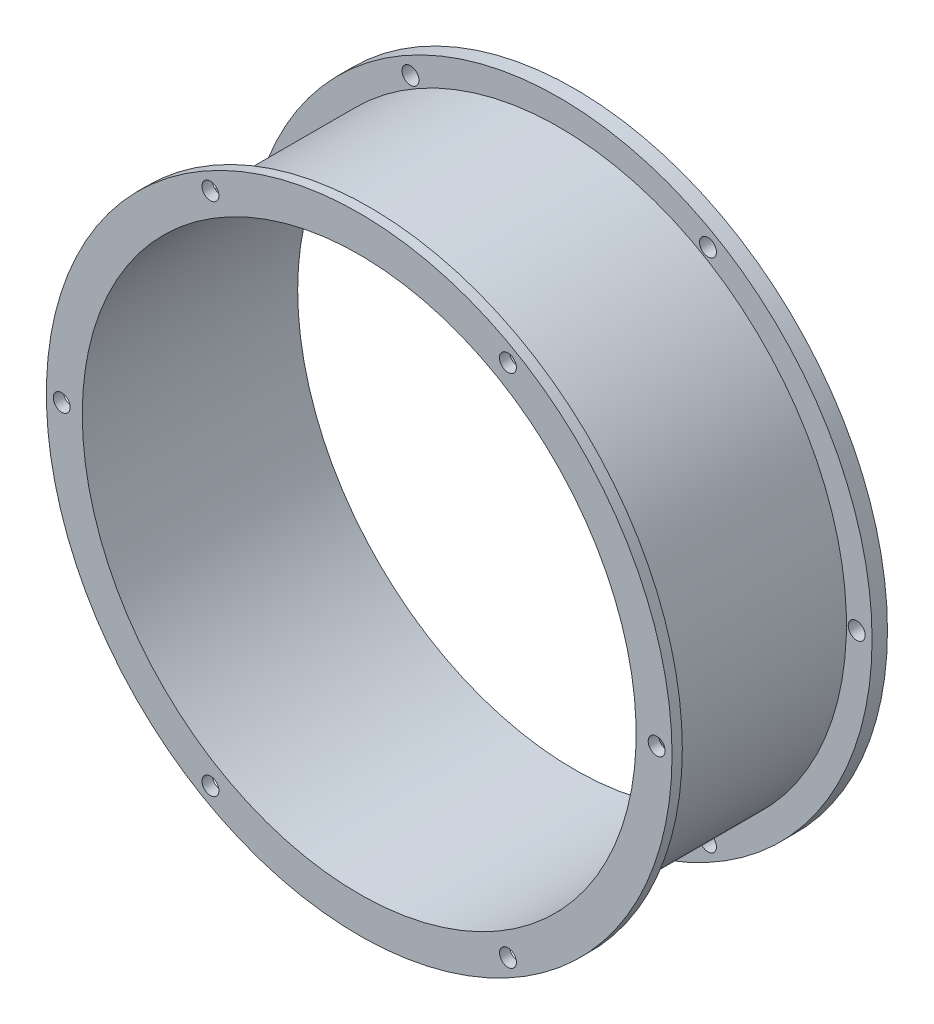
ISO-10303-21;
HEADER;
FILE_DESCRIPTION(('STEP AP214'),'2;1');
FILE_NAME('part.step','',(''),(''),'','','');
FILE_SCHEMA(('AUTOMOTIVE_DESIGN { 1 0 10303 214 1 1 1 1 }'));
ENDSEC;
DATA;
#1=APPLICATION_CONTEXT('core data for automotive mechanical design processes');
#2=APPLICATION_PROTOCOL_DEFINITION('international standard','automotive_design',2000,#1);
#3=PRODUCT_CONTEXT('',#1,'mechanical');
#4=PRODUCT('Part','Part','',(#3));
#5=PRODUCT_RELATED_PRODUCT_CATEGORY('part','',(#4));
#6=PRODUCT_DEFINITION_FORMATION('','',#4);
#7=PRODUCT_DEFINITION_CONTEXT('part definition',#1,'design');
#8=PRODUCT_DEFINITION('design','',#6,#7);
#9=PRODUCT_DEFINITION_SHAPE('','',#8);
#10=(LENGTH_UNIT() NAMED_UNIT(*) SI_UNIT(.MILLI.,.METRE.));
#11=(NAMED_UNIT(*) PLANE_ANGLE_UNIT() SI_UNIT($,.RADIAN.));
#12=(NAMED_UNIT(*) SI_UNIT($,.STERADIAN.) SOLID_ANGLE_UNIT());
#13=UNCERTAINTY_MEASURE_WITH_UNIT(LENGTH_MEASURE(1.E-05),#10,'distance_accuracy_value','');
#14=(GEOMETRIC_REPRESENTATION_CONTEXT(3) GLOBAL_UNCERTAINTY_ASSIGNED_CONTEXT((#13)) GLOBAL_UNIT_ASSIGNED_CONTEXT((#10,
#11,#12)) REPRESENTATION_CONTEXT('',''));
#15=CARTESIAN_POINT('',(0.,0.,0.));
#16=DIRECTION('',(0.,0.,1.));
#17=DIRECTION('',(1.,0.,0.));
#18=AXIS2_PLACEMENT_3D('',#15,#16,#17);
#19=CARTESIAN_POINT('',(0.,0.,15.));
#20=DIRECTION('',(0.,0.,-1.));
#21=DIRECTION('',(-1.,0.,0.));
#22=AXIS2_PLACEMENT_3D('',#19,#20,#21);
#23=CYLINDRICAL_SURFACE('',#22,56.);
#24=CARTESIAN_POINT('',(0.,0.,-24.));
#25=DIRECTION('',(0.,0.,1.));
#26=DIRECTION('',(1.,0.,0.));
#27=AXIS2_PLACEMENT_3D('',#24,#25,#26);
#28=CIRCLE('',#27,56.);
#29=CARTESIAN_POINT('',(-56.,0.,-24.));
#30=VERTEX_POINT('',#29);
#31=EDGE_CURVE('E62',#30,#30,#28,.T.);
#32=CARTESIAN_POINT('',(0.,0.,13.));
#33=DIRECTION('',(0.,0.,1.));
#34=DIRECTION('',(1.,0.,0.));
#35=AXIS2_PLACEMENT_3D('',#32,#33,#34);
#36=CIRCLE('',#35,56.);
#37=CARTESIAN_POINT('',(-56.,0.,13.));
#38=VERTEX_POINT('',#37);
#39=EDGE_CURVE('E10',#38,#38,#36,.T.);
#40=CARTESIAN_POINT('',(-56.,0.,-24.));
#41=CARTESIAN_POINT('',(-56.,0.,-23.6145833333333));
#42=CARTESIAN_POINT('',(-56.,0.,-23.2291666666667));
#43=CARTESIAN_POINT('',(-56.,0.,-22.4583333333333));
#44=CARTESIAN_POINT('',(-56.,0.,-22.0729166666667));
#45=CARTESIAN_POINT('',(-56.,0.,-21.3020833333333));
#46=CARTESIAN_POINT('',(-56.,0.,-20.9166666666667));
#47=CARTESIAN_POINT('',(-56.,0.,-20.1458333333333));
#48=CARTESIAN_POINT('',(-56.,0.,-19.7604166666667));
#49=CARTESIAN_POINT('',(-56.,0.,-18.9895833333333));
#50=CARTESIAN_POINT('',(-56.,0.,-18.6041666666667));
#51=CARTESIAN_POINT('',(-56.,0.,-17.8333333333333));
#52=CARTESIAN_POINT('',(-56.,0.,-17.4479166666667));
#53=CARTESIAN_POINT('',(-56.,0.,-16.6770833333333));
#54=CARTESIAN_POINT('',(-56.,0.,-16.2916666666667));
#55=CARTESIAN_POINT('',(-56.,0.,-15.5208333333333));
#56=CARTESIAN_POINT('',(-56.,0.,-15.1354166666667));
#57=CARTESIAN_POINT('',(-56.,0.,-14.3645833333333));
#58=CARTESIAN_POINT('',(-56.,0.,-13.9791666666667));
#59=CARTESIAN_POINT('',(-56.,0.,-13.2083333333333));
#60=CARTESIAN_POINT('',(-56.,0.,-12.8229166666667));
#61=CARTESIAN_POINT('',(-56.,0.,-12.0520833333333));
#62=CARTESIAN_POINT('',(-56.,0.,-11.6666666666667));
#63=CARTESIAN_POINT('',(-56.,0.,-10.8958333333333));
#64=CARTESIAN_POINT('',(-56.,0.,-10.5104166666667));
#65=CARTESIAN_POINT('',(-56.,0.,-9.73958333333334));
#66=CARTESIAN_POINT('',(-56.,0.,-9.35416666666667));
#67=CARTESIAN_POINT('',(-56.,0.,-8.58333333333334));
#68=CARTESIAN_POINT('',(-56.,0.,-8.19791666666667));
#69=CARTESIAN_POINT('',(-56.,0.,-7.42708333333334));
#70=CARTESIAN_POINT('',(-56.,0.,-7.04166666666667));
#71=CARTESIAN_POINT('',(-56.,0.,-6.27083333333334));
#72=CARTESIAN_POINT('',(-56.,0.,-5.88541666666667));
#73=CARTESIAN_POINT('',(-56.,0.,-5.11458333333334));
#74=CARTESIAN_POINT('',(-56.,0.,-4.72916666666667));
#75=CARTESIAN_POINT('',(-56.,0.,-3.95833333333334));
#76=CARTESIAN_POINT('',(-56.,0.,-3.57291666666667));
#77=CARTESIAN_POINT('',(-56.,0.,-2.80208333333334));
#78=CARTESIAN_POINT('',(-56.,0.,-2.41666666666667));
#79=CARTESIAN_POINT('',(-56.,0.,-1.64583333333333));
#80=CARTESIAN_POINT('',(-56.,0.,-1.26041666666667));
#81=CARTESIAN_POINT('',(-56.,0.,-0.489583333333336));
#82=CARTESIAN_POINT('',(-56.,0.,-0.10416666666667));
#83=CARTESIAN_POINT('',(-56.,0.,0.666666666666662));
#84=CARTESIAN_POINT('',(-56.,0.,1.05208333333333));
#85=CARTESIAN_POINT('',(-56.,0.,1.82291666666666));
#86=CARTESIAN_POINT('',(-56.,0.,2.20833333333333));
#87=CARTESIAN_POINT('',(-56.,0.,2.97916666666666));
#88=CARTESIAN_POINT('',(-56.,0.,3.36458333333333));
#89=CARTESIAN_POINT('',(-56.,0.,4.13541666666667));
#90=CARTESIAN_POINT('',(-56.,0.,4.52083333333333));
#91=CARTESIAN_POINT('',(-56.,0.,5.29166666666667));
#92=CARTESIAN_POINT('',(-56.,0.,5.67708333333333));
#93=CARTESIAN_POINT('',(-56.,0.,6.44791666666667));
#94=CARTESIAN_POINT('',(-56.,0.,6.83333333333333));
#95=CARTESIAN_POINT('',(-56.,0.,7.60416666666667));
#96=CARTESIAN_POINT('',(-56.,0.,7.98958333333333));
#97=CARTESIAN_POINT('',(-56.,0.,8.76041666666666));
#98=CARTESIAN_POINT('',(-56.,0.,9.14583333333333));
#99=CARTESIAN_POINT('',(-56.,0.,9.91666666666667));
#100=CARTESIAN_POINT('',(-56.,0.,10.3020833333333));
#101=CARTESIAN_POINT('',(-56.,0.,11.0729166666667));
#102=CARTESIAN_POINT('',(-56.,0.,11.4583333333333));
#103=CARTESIAN_POINT('',(-56.,0.,12.2291666666667));
#104=CARTESIAN_POINT('',(-56.,0.,12.6145833333333));
#105=CARTESIAN_POINT('',(-56.,0.,13.));
#106=B_SPLINE_CURVE_WITH_KNOTS('',3,(#40,#41,#42,#43,#44,#45,#46,#47,#48,#49,#50,#51,#52,#53,
#54,#55,#56,#57,#58,#59,#60,#61,#62,#63,#64,#65,#66,#67,#68,#69,#70,#71,#72,#73,#74,#75,#76,#77,
#78,#79,#80,#81,#82,#83,#84,#85,#86,#87,#88,#89,#90,#91,#92,#93,#94,#95,#96,#97,#98,#99,#100,
#101,#102,#103,#104,#105),.UNSPECIFIED.,.F.,.F.,(4,2,2,2,2,2,2,2,2,2,2,2,2,2,2,2,2,2,2,2,2,2,2,
2,2,2,2,2,2,2,2,2,4),(0.,1.15625,2.3125,3.46875,4.625,5.78125,6.93750000000001,8.09375,9.25,
10.40625,11.5625,12.71875,13.875,15.03125,16.1875,17.34375,18.5,19.65625,20.8125,21.96875,
23.125,24.28125,25.4375,26.59375,27.75,28.90625,30.0625,31.21875,32.375,33.53125,34.6875,
35.84375,37.),.UNSPECIFIED.);
#107=EDGE_CURVE('BSEAM36',#30,#38,#106,.T.);
#108=ORIENTED_EDGE('',*,*,#31,.T.);
#109=ORIENTED_EDGE('',*,*,#39,.F.);
#110=ORIENTED_EDGE('',*,*,#107,.T.);
#111=ORIENTED_EDGE('',*,*,#107,.F.);
#112=EDGE_LOOP('',(#108,#110,#109,#111));
#113=FACE_BOUND('',#112,.T.);
#114=ADVANCED_FACE('F36',(#113),#23,.T.);
#115=CARTESIAN_POINT('',(0.,0.,15.));
#116=DIRECTION('',(0.,0.,1.));
#117=DIRECTION('',(1.,0.,0.));
#118=AXIS2_PLACEMENT_3D('',#115,#116,#117);
#119=PLANE('',#118);
#120=CARTESIAN_POINT('',(58.,0.,15.));
#121=DIRECTION('',(0.,0.,1.));
#122=DIRECTION('',(1.,0.,0.));
#123=AXIS2_PLACEMENT_3D('',#120,#121,#122);
#124=CIRCLE('',#123,1.65);
#125=CARTESIAN_POINT('',(59.65,0.,15.));
#126=VERTEX_POINT('',#125);
#127=EDGE_CURVE('E135',#126,#126,#124,.T.);
#128=ORIENTED_EDGE('',*,*,#127,.F.);
#129=EDGE_LOOP('',(#128));
#130=FACE_BOUND('',#129,.T.);
#131=CARTESIAN_POINT('',(29.,-50.2294734194974,15.));
#132=DIRECTION('',(0.,0.,1.));
#133=DIRECTION('',(1.,0.,0.));
#134=AXIS2_PLACEMENT_3D('',#131,#132,#133);
#135=CIRCLE('',#134,1.65);
#136=CARTESIAN_POINT('',(30.65,-50.2294734194974,15.));
#137=VERTEX_POINT('',#136);
#138=EDGE_CURVE('E124',#137,#137,#135,.T.);
#139=ORIENTED_EDGE('',*,*,#138,.F.);
#140=EDGE_LOOP('',(#139));
#141=FACE_BOUND('',#140,.T.);
#142=CARTESIAN_POINT('',(-29.,-50.2294734194974,15.));
#143=DIRECTION('',(0.,0.,1.));
#144=DIRECTION('',(1.,0.,0.));
#145=AXIS2_PLACEMENT_3D('',#142,#143,#144);
#146=CIRCLE('',#145,1.65);
#147=CARTESIAN_POINT('',(-27.35,-50.2294734194974,15.));
#148=VERTEX_POINT('',#147);
#149=EDGE_CURVE('E100',#148,#148,#146,.T.);
#150=ORIENTED_EDGE('',*,*,#149,.F.);
#151=EDGE_LOOP('',(#150));
#152=FACE_BOUND('',#151,.T.);
#153=CARTESIAN_POINT('',(-58.,0.,15.));
#154=DIRECTION('',(0.,0.,1.));
#155=DIRECTION('',(1.,0.,0.));
#156=AXIS2_PLACEMENT_3D('',#153,#154,#155);
#157=CIRCLE('',#156,1.65);
#158=CARTESIAN_POINT('',(-56.35,0.,15.));
#159=VERTEX_POINT('',#158);
#160=EDGE_CURVE('E95',#159,#159,#157,.T.);
#161=ORIENTED_EDGE('',*,*,#160,.F.);
#162=EDGE_LOOP('',(#161));
#163=FACE_BOUND('',#162,.T.);
#164=CARTESIAN_POINT('',(-29.,50.2294734194974,15.));
#165=DIRECTION('',(0.,0.,1.));
#166=DIRECTION('',(1.,0.,0.));
#167=AXIS2_PLACEMENT_3D('',#164,#165,#166);
#168=CIRCLE('',#167,1.65);
#169=CARTESIAN_POINT('',(-27.35,50.2294734194974,15.));
#170=VERTEX_POINT('',#169);
#171=EDGE_CURVE('E90',#170,#170,#168,.T.);
#172=ORIENTED_EDGE('',*,*,#171,.F.);
#173=EDGE_LOOP('',(#172));
#174=FACE_BOUND('',#173,.T.);
#175=CARTESIAN_POINT('',(29.,50.2294734194974,15.));
#176=DIRECTION('',(0.,0.,1.));
#177=DIRECTION('',(1.,0.,0.));
#178=AXIS2_PLACEMENT_3D('',#175,#176,#177);
#179=CIRCLE('',#178,1.65);
#180=CARTESIAN_POINT('',(30.65,50.2294734194974,15.));
#181=VERTEX_POINT('',#180);
#182=EDGE_CURVE('E84',#181,#181,#179,.T.);
#183=ORIENTED_EDGE('',*,*,#182,.F.);
#184=EDGE_LOOP('',(#183));
#185=FACE_BOUND('',#184,.T.);
#186=CARTESIAN_POINT('',(0.,0.,15.));
#187=DIRECTION('',(0.,0.,1.));
#188=DIRECTION('',(1.,0.,0.));
#189=AXIS2_PLACEMENT_3D('',#186,#187,#188);
#190=CIRCLE('',#189,54.);
#191=CARTESIAN_POINT('',(-54.,0.,15.));
#192=VERTEX_POINT('',#191);
#193=EDGE_CURVE('E44',#192,#192,#190,.T.);
#194=ORIENTED_EDGE('',*,*,#193,.F.);
#195=EDGE_LOOP('',(#194));
#196=FACE_BOUND('',#195,.T.);
#197=CARTESIAN_POINT('',(0.,0.,15.));
#198=DIRECTION('',(0.,0.,1.));
#199=DIRECTION('',(1.,0.,0.));
#200=AXIS2_PLACEMENT_3D('',#197,#198,#199);
#201=CIRCLE('',#200,61.);
#202=CARTESIAN_POINT('',(61.,0.,15.));
#203=VERTEX_POINT('',#202);
#204=EDGE_CURVE('E67',#203,#203,#201,.T.);
#205=ORIENTED_EDGE('',*,*,#204,.T.);
#206=EDGE_LOOP('',(#205));
#207=FACE_BOUND('',#206,.T.);
#208=ADVANCED_FACE('F168',(#130,#141,#152,#163,#174,#185,#196,#207),#119,.T.);
#209=CARTESIAN_POINT('',(0.,0.,-27.));
#210=DIRECTION('',(0.,0.,1.));
#211=DIRECTION('',(1.,0.,0.));
#212=AXIS2_PLACEMENT_3D('',#209,#210,#211);
#213=PLANE('',#212);
#214=CARTESIAN_POINT('',(58.,0.,-27.));
#215=DIRECTION('',(0.,0.,1.));
#216=DIRECTION('',(1.,0.,0.));
#217=AXIS2_PLACEMENT_3D('',#214,#215,#216);
#218=CIRCLE('',#217,1.65);
#219=CARTESIAN_POINT('',(59.65,0.,-27.));
#220=VERTEX_POINT('',#219);
#221=EDGE_CURVE('E131',#220,#220,#218,.T.);
#222=ORIENTED_EDGE('',*,*,#221,.T.);
#223=EDGE_LOOP('',(#222));
#224=FACE_BOUND('',#223,.T.);
#225=CARTESIAN_POINT('',(29.,-50.2294734194974,-27.));
#226=DIRECTION('',(0.,0.,1.));
#227=DIRECTION('',(1.,0.,0.));
#228=AXIS2_PLACEMENT_3D('',#225,#226,#227);
#229=CIRCLE('',#228,1.65);
#230=CARTESIAN_POINT('',(30.65,-50.2294734194974,-27.));
#231=VERTEX_POINT('',#230);
#232=EDGE_CURVE('E107',#231,#231,#229,.T.);
#233=ORIENTED_EDGE('',*,*,#232,.T.);
#234=EDGE_LOOP('',(#233));
#235=FACE_BOUND('',#234,.T.);
#236=CARTESIAN_POINT('',(-29.,-50.2294734194974,-27.));
#237=DIRECTION('',(0.,0.,1.));
#238=DIRECTION('',(1.,0.,0.));
#239=AXIS2_PLACEMENT_3D('',#236,#237,#238);
#240=CIRCLE('',#239,1.65);
#241=CARTESIAN_POINT('',(-27.35,-50.2294734194974,-27.));
#242=VERTEX_POINT('',#241);
#243=EDGE_CURVE('E111',#242,#242,#240,.T.);
#244=ORIENTED_EDGE('',*,*,#243,.T.);
#245=EDGE_LOOP('',(#244));
#246=FACE_BOUND('',#245,.T.);
#247=CARTESIAN_POINT('',(-58.,0.,-27.));
#248=DIRECTION('',(0.,0.,1.));
#249=DIRECTION('',(1.,0.,0.));
#250=AXIS2_PLACEMENT_3D('',#247,#248,#249);
#251=CIRCLE('',#250,1.65);
#252=CARTESIAN_POINT('',(-56.35,0.,-27.));
#253=VERTEX_POINT('',#252);
#254=EDGE_CURVE('E203',#253,#253,#251,.T.);
#255=ORIENTED_EDGE('',*,*,#254,.T.);
#256=EDGE_LOOP('',(#255));
#257=FACE_BOUND('',#256,.T.);
#258=CARTESIAN_POINT('',(-29.,50.2294734194974,-27.));
#259=DIRECTION('',(0.,0.,1.));
#260=DIRECTION('',(1.,0.,0.));
#261=AXIS2_PLACEMENT_3D('',#258,#259,#260);
#262=CIRCLE('',#261,1.65);
#263=CARTESIAN_POINT('',(-27.35,50.2294734194974,-27.));
#264=VERTEX_POINT('',#263);
#265=EDGE_CURVE('E207',#264,#264,#262,.T.);
#266=ORIENTED_EDGE('',*,*,#265,.T.);
#267=EDGE_LOOP('',(#266));
#268=FACE_BOUND('',#267,.T.);
#269=CARTESIAN_POINT('',(29.,50.2294734194974,-27.));
#270=DIRECTION('',(0.,0.,1.));
#271=DIRECTION('',(1.,0.,0.));
#272=AXIS2_PLACEMENT_3D('',#269,#270,#271);
#273=CIRCLE('',#272,1.65);
#274=CARTESIAN_POINT('',(30.65,50.2294734194974,-27.));
#275=VERTEX_POINT('',#274);
#276=EDGE_CURVE('E211',#275,#275,#273,.T.);
#277=ORIENTED_EDGE('',*,*,#276,.T.);
#278=EDGE_LOOP('',(#277));
#279=FACE_BOUND('',#278,.T.);
#280=CARTESIAN_POINT('',(0.,0.,-27.));
#281=DIRECTION('',(0.,0.,1.));
#282=DIRECTION('',(1.,0.,0.));
#283=AXIS2_PLACEMENT_3D('',#280,#281,#282);
#284=CIRCLE('',#283,54.);
#285=CARTESIAN_POINT('',(-54.,0.,-27.));
#286=VERTEX_POINT('',#285);
#287=EDGE_CURVE('E52',#286,#286,#284,.T.);
#288=ORIENTED_EDGE('',*,*,#287,.T.);
#289=EDGE_LOOP('',(#288));
#290=FACE_BOUND('',#289,.T.);
#291=CARTESIAN_POINT('',(0.,0.,-27.));
#292=DIRECTION('',(0.,0.,1.));
#293=DIRECTION('',(1.,0.,0.));
#294=AXIS2_PLACEMENT_3D('',#291,#292,#293);
#295=CIRCLE('',#294,61.);
#296=CARTESIAN_POINT('',(61.,0.,-27.));
#297=VERTEX_POINT('',#296);
#298=EDGE_CURVE('E63',#297,#297,#295,.T.);
#299=ORIENTED_EDGE('',*,*,#298,.F.);
#300=EDGE_LOOP('',(#299));
#301=FACE_BOUND('',#300,.T.);
#302=ADVANCED_FACE('F173',(#224,#235,#246,#257,#268,#279,#290,#301),#213,.F.);
#303=CARTESIAN_POINT('',(0.,0.,15.));
#304=DIRECTION('',(0.,0.,-1.));
#305=DIRECTION('',(-1.,0.,0.));
#306=AXIS2_PLACEMENT_3D('',#303,#304,#305);
#307=CYLINDRICAL_SURFACE('',#306,54.);
#308=CARTESIAN_POINT('',(-54.,0.,15.));
#309=CARTESIAN_POINT('',(-54.,0.,14.5625));
#310=CARTESIAN_POINT('',(-54.,0.,14.125));
#311=CARTESIAN_POINT('',(-54.,0.,13.25));
#312=CARTESIAN_POINT('',(-54.,0.,12.8125));
#313=CARTESIAN_POINT('',(-54.,0.,11.9375));
#314=CARTESIAN_POINT('',(-54.,0.,11.5));
#315=CARTESIAN_POINT('',(-54.,0.,10.625));
#316=CARTESIAN_POINT('',(-54.,0.,10.1875));
#317=CARTESIAN_POINT('',(-54.,0.,9.3125));
#318=CARTESIAN_POINT('',(-54.,0.,8.875));
#319=CARTESIAN_POINT('',(-54.,0.,8.));
#320=CARTESIAN_POINT('',(-54.,0.,7.5625));
#321=CARTESIAN_POINT('',(-54.,0.,6.6875));
#322=CARTESIAN_POINT('',(-54.,0.,6.25));
#323=CARTESIAN_POINT('',(-54.,0.,5.375));
#324=CARTESIAN_POINT('',(-54.,0.,4.9375));
#325=CARTESIAN_POINT('',(-54.,0.,4.0625));
#326=CARTESIAN_POINT('',(-54.,0.,3.625));
#327=CARTESIAN_POINT('',(-54.,0.,2.75));
#328=CARTESIAN_POINT('',(-54.,0.,2.3125));
#329=CARTESIAN_POINT('',(-54.,0.,1.4375));
#330=CARTESIAN_POINT('',(-54.,0.,1.));
#331=CARTESIAN_POINT('',(-54.,0.,0.125000000000001));
#332=CARTESIAN_POINT('',(-54.,0.,-0.312499999999998));
#333=CARTESIAN_POINT('',(-54.,0.,-1.1875));
#334=CARTESIAN_POINT('',(-54.,0.,-1.625));
#335=CARTESIAN_POINT('',(-54.,0.,-2.5));
#336=CARTESIAN_POINT('',(-54.,0.,-2.9375));
#337=CARTESIAN_POINT('',(-54.,0.,-3.8125));
#338=CARTESIAN_POINT('',(-54.,0.,-4.25));
#339=CARTESIAN_POINT('',(-54.,0.,-5.125));
#340=CARTESIAN_POINT('',(-54.,0.,-5.5625));
#341=CARTESIAN_POINT('',(-54.,0.,-6.4375));
#342=CARTESIAN_POINT('',(-54.,0.,-6.875));
#343=CARTESIAN_POINT('',(-54.,0.,-7.75));
#344=CARTESIAN_POINT('',(-54.,0.,-8.1875));
#345=CARTESIAN_POINT('',(-54.,0.,-9.0625));
#346=CARTESIAN_POINT('',(-54.,0.,-9.5));
#347=CARTESIAN_POINT('',(-54.,0.,-10.375));
#348=CARTESIAN_POINT('',(-54.,0.,-10.8125));
#349=CARTESIAN_POINT('',(-54.,0.,-11.6875));
#350=CARTESIAN_POINT('',(-54.,0.,-12.125));
#351=CARTESIAN_POINT('',(-54.,0.,-13.));
#352=CARTESIAN_POINT('',(-54.,0.,-13.4375));
#353=CARTESIAN_POINT('',(-54.,0.,-14.3125));
#354=CARTESIAN_POINT('',(-54.,0.,-14.75));
#355=CARTESIAN_POINT('',(-54.,0.,-15.625));
#356=CARTESIAN_POINT('',(-54.,0.,-16.0625));
#357=CARTESIAN_POINT('',(-54.,0.,-16.9375));
#358=CARTESIAN_POINT('',(-54.,0.,-17.375));
#359=CARTESIAN_POINT('',(-54.,0.,-18.25));
#360=CARTESIAN_POINT('',(-54.,0.,-18.6875));
#361=CARTESIAN_POINT('',(-54.,0.,-19.5625));
#362=CARTESIAN_POINT('',(-54.,0.,-20.));
#363=CARTESIAN_POINT('',(-54.,0.,-20.875));
#364=CARTESIAN_POINT('',(-54.,0.,-21.3125));
#365=CARTESIAN_POINT('',(-54.,0.,-22.1875));
#366=CARTESIAN_POINT('',(-54.,0.,-22.625));
#367=CARTESIAN_POINT('',(-54.,0.,-23.5));
#368=CARTESIAN_POINT('',(-54.,0.,-23.9375));
#369=CARTESIAN_POINT('',(-54.,0.,-24.8125));
#370=CARTESIAN_POINT('',(-54.,0.,-25.25));
#371=CARTESIAN_POINT('',(-54.,0.,-26.125));
#372=CARTESIAN_POINT('',(-54.,0.,-26.5625));
#373=CARTESIAN_POINT('',(-54.,0.,-27.));
#374=B_SPLINE_CURVE_WITH_KNOTS('',3,(#308,#309,#310,#311,#312,#313,#314,#315,#316,#317,#318,
#319,#320,#321,#322,#323,#324,#325,#326,#327,#328,#329,#330,#331,#332,#333,#334,#335,#336,#337,
#338,#339,#340,#341,#342,#343,#344,#345,#346,#347,#348,#349,#350,#351,#352,#353,#354,#355,#356,
#357,#358,#359,#360,#361,#362,#363,#364,#365,#366,#367,#368,#369,#370,#371,#372,#373),
.UNSPECIFIED.,.F.,.F.,(4,2,2,2,2,2,2,2,2,2,2,2,2,2,2,2,2,2,2,2,2,2,2,2,2,2,2,2,2,2,2,2,4),(0.,
1.3125,2.625,3.9375,5.25,6.5625,7.875,9.1875,10.5,11.8125,13.125,14.4375,15.75,17.0625,18.375,
19.6875,21.,22.3125,23.625,24.9375,26.25,27.5625,28.875,30.1875,31.5,32.8125,34.125,35.4375,
36.75,38.0625,39.375,40.6875,42.),.UNSPECIFIED.);
#375=EDGE_CURVE('BSEAM180',#192,#286,#374,.T.);
#376=ORIENTED_EDGE('',*,*,#193,.T.);
#377=ORIENTED_EDGE('',*,*,#287,.F.);
#378=ORIENTED_EDGE('',*,*,#375,.T.);
#379=ORIENTED_EDGE('',*,*,#375,.F.);
#380=EDGE_LOOP('',(#376,#378,#377,#379));
#381=FACE_BOUND('',#380,.T.);
#382=ADVANCED_FACE('F180',(#381),#307,.F.);
#383=CARTESIAN_POINT('',(0.,0.,-24.));
#384=DIRECTION('',(0.,0.,1.));
#385=DIRECTION('',(1.,0.,0.));
#386=AXIS2_PLACEMENT_3D('',#383,#384,#385);
#387=PLANE('',#386);
#388=CARTESIAN_POINT('',(58.,0.,-24.));
#389=DIRECTION('',(0.,0.,1.));
#390=DIRECTION('',(1.,0.,0.));
#391=AXIS2_PLACEMENT_3D('',#388,#389,#390);
#392=CIRCLE('',#391,1.65);
#393=CARTESIAN_POINT('',(59.65,0.,-24.));
#394=VERTEX_POINT('',#393);
#395=EDGE_CURVE('E127',#394,#394,#392,.T.);
#396=ORIENTED_EDGE('',*,*,#395,.F.);
#397=EDGE_LOOP('',(#396));
#398=FACE_BOUND('',#397,.T.);
#399=CARTESIAN_POINT('',(29.,-50.2294734194974,-24.));
#400=DIRECTION('',(0.,0.,1.));
#401=DIRECTION('',(1.,0.,0.));
#402=AXIS2_PLACEMENT_3D('',#399,#400,#401);
#403=CIRCLE('',#402,1.65);
#404=CARTESIAN_POINT('',(30.65,-50.2294734194974,-24.));
#405=VERTEX_POINT('',#404);
#406=EDGE_CURVE('E99',#405,#405,#403,.T.);
#407=ORIENTED_EDGE('',*,*,#406,.F.);
#408=EDGE_LOOP('',(#407));
#409=FACE_BOUND('',#408,.T.);
#410=CARTESIAN_POINT('',(-29.,-50.2294734194974,-24.));
#411=DIRECTION('',(0.,0.,1.));
#412=DIRECTION('',(1.,0.,0.));
#413=AXIS2_PLACEMENT_3D('',#410,#411,#412);
#414=CIRCLE('',#413,1.65);
#415=CARTESIAN_POINT('',(-27.35,-50.2294734194974,-24.));
#416=VERTEX_POINT('',#415);
#417=EDGE_CURVE('E94',#416,#416,#414,.T.);
#418=ORIENTED_EDGE('',*,*,#417,.F.);
#419=EDGE_LOOP('',(#418));
#420=FACE_BOUND('',#419,.T.);
#421=CARTESIAN_POINT('',(-58.,0.,-24.));
#422=DIRECTION('',(0.,0.,1.));
#423=DIRECTION('',(1.,0.,0.));
#424=AXIS2_PLACEMENT_3D('',#421,#422,#423);
#425=CIRCLE('',#424,1.65);
#426=CARTESIAN_POINT('',(-56.35,0.,-24.));
#427=VERTEX_POINT('',#426);
#428=EDGE_CURVE('E89',#427,#427,#425,.T.);
#429=ORIENTED_EDGE('',*,*,#428,.F.);
#430=EDGE_LOOP('',(#429));
#431=FACE_BOUND('',#430,.T.);
#432=CARTESIAN_POINT('',(-29.,50.2294734194974,-24.));
#433=DIRECTION('',(0.,0.,1.));
#434=DIRECTION('',(1.,0.,0.));
#435=AXIS2_PLACEMENT_3D('',#432,#433,#434);
#436=CIRCLE('',#435,1.65);
#437=CARTESIAN_POINT('',(-27.35,50.2294734194974,-24.));
#438=VERTEX_POINT('',#437);
#439=EDGE_CURVE('E83',#438,#438,#436,.T.);
#440=ORIENTED_EDGE('',*,*,#439,.F.);
#441=EDGE_LOOP('',(#440));
#442=FACE_BOUND('',#441,.T.);
#443=CARTESIAN_POINT('',(29.,50.2294734194974,-24.));
#444=DIRECTION('',(0.,0.,1.));
#445=DIRECTION('',(1.,0.,0.));
#446=AXIS2_PLACEMENT_3D('',#443,#444,#445);
#447=CIRCLE('',#446,1.65);
#448=CARTESIAN_POINT('',(30.65,50.2294734194974,-24.));
#449=VERTEX_POINT('',#448);
#450=EDGE_CURVE('E78',#449,#449,#447,.T.);
#451=ORIENTED_EDGE('',*,*,#450,.F.);
#452=EDGE_LOOP('',(#451));
#453=FACE_BOUND('',#452,.T.);
#454=CARTESIAN_POINT('',(0.,0.,-24.));
#455=DIRECTION('',(0.,0.,1.));
#456=DIRECTION('',(1.,0.,0.));
#457=AXIS2_PLACEMENT_3D('',#454,#455,#456);
#458=CIRCLE('',#457,61.);
#459=CARTESIAN_POINT('',(61.,0.,-24.));
#460=VERTEX_POINT('',#459);
#461=EDGE_CURVE('E58',#460,#460,#458,.T.);
#462=ORIENTED_EDGE('',*,*,#461,.T.);
#463=EDGE_LOOP('',(#462));
#464=FACE_BOUND('',#463,.T.);
#465=ORIENTED_EDGE('',*,*,#31,.F.);
#466=EDGE_LOOP('',(#465));
#467=FACE_BOUND('',#466,.T.);
#468=ADVANCED_FACE('F162',(#398,#409,#420,#431,#442,#453,#464,#467),#387,.T.);
#469=CARTESIAN_POINT('',(0.,0.,-24.));
#470=DIRECTION('',(0.,0.,-1.));
#471=DIRECTION('',(-1.,0.,0.));
#472=AXIS2_PLACEMENT_3D('',#469,#470,#471);
#473=CYLINDRICAL_SURFACE('',#472,61.);
#474=ORIENTED_EDGE('',*,*,#461,.F.);
#475=EDGE_LOOP('',(#474));
#476=FACE_BOUND('',#475,.T.);
#477=ORIENTED_EDGE('',*,*,#298,.T.);
#478=EDGE_LOOP('',(#477));
#479=FACE_BOUND('',#478,.T.);
#480=ADVANCED_FACE('F152',(#476,#479),#473,.T.);
#481=CARTESIAN_POINT('',(0.,0.,13.));
#482=DIRECTION('',(0.,0.,1.));
#483=DIRECTION('',(1.,0.,0.));
#484=AXIS2_PLACEMENT_3D('',#481,#482,#483);
#485=PLANE('',#484);
#486=CARTESIAN_POINT('',(58.,0.,13.));
#487=DIRECTION('',(0.,0.,1.));
#488=DIRECTION('',(1.,0.,0.));
#489=AXIS2_PLACEMENT_3D('',#486,#487,#488);
#490=CIRCLE('',#489,1.65);
#491=CARTESIAN_POINT('',(59.65,0.,13.));
#492=VERTEX_POINT('',#491);
#493=EDGE_CURVE('E39',#492,#492,#490,.T.);
#494=ORIENTED_EDGE('',*,*,#493,.T.);
#495=EDGE_LOOP('',(#494));
#496=FACE_BOUND('',#495,.T.);
#497=CARTESIAN_POINT('',(29.,-50.2294734194974,13.));
#498=DIRECTION('',(0.,0.,1.));
#499=DIRECTION('',(1.,0.,0.));
#500=AXIS2_PLACEMENT_3D('',#497,#498,#499);
#501=CIRCLE('',#500,1.65);
#502=CARTESIAN_POINT('',(30.65,-50.2294734194974,13.));
#503=VERTEX_POINT('',#502);
#504=EDGE_CURVE('E96',#503,#503,#501,.T.);
#505=ORIENTED_EDGE('',*,*,#504,.T.);
#506=EDGE_LOOP('',(#505));
#507=FACE_BOUND('',#506,.T.);
#508=CARTESIAN_POINT('',(-29.,-50.2294734194974,13.));
#509=DIRECTION('',(0.,0.,1.));
#510=DIRECTION('',(1.,0.,0.));
#511=AXIS2_PLACEMENT_3D('',#508,#509,#510);
#512=CIRCLE('',#511,1.65);
#513=CARTESIAN_POINT('',(-27.35,-50.2294734194974,13.));
#514=VERTEX_POINT('',#513);
#515=EDGE_CURVE('E91',#514,#514,#512,.T.);
#516=ORIENTED_EDGE('',*,*,#515,.T.);
#517=EDGE_LOOP('',(#516));
#518=FACE_BOUND('',#517,.T.);
#519=CARTESIAN_POINT('',(-58.,0.,13.));
#520=DIRECTION('',(0.,0.,1.));
#521=DIRECTION('',(1.,0.,0.));
#522=AXIS2_PLACEMENT_3D('',#519,#520,#521);
#523=CIRCLE('',#522,1.65);
#524=CARTESIAN_POINT('',(-56.35,0.,13.));
#525=VERTEX_POINT('',#524);
#526=EDGE_CURVE('E85',#525,#525,#523,.T.);
#527=ORIENTED_EDGE('',*,*,#526,.T.);
#528=EDGE_LOOP('',(#527));
#529=FACE_BOUND('',#528,.T.);
#530=CARTESIAN_POINT('',(-29.,50.2294734194974,13.));
#531=DIRECTION('',(0.,0.,1.));
#532=DIRECTION('',(1.,0.,0.));
#533=AXIS2_PLACEMENT_3D('',#530,#531,#532);
#534=CIRCLE('',#533,1.65);
#535=CARTESIAN_POINT('',(-27.35,50.2294734194974,13.));
#536=VERTEX_POINT('',#535);
#537=EDGE_CURVE('E79',#536,#536,#534,.T.);
#538=ORIENTED_EDGE('',*,*,#537,.T.);
#539=EDGE_LOOP('',(#538));
#540=FACE_BOUND('',#539,.T.);
#541=CARTESIAN_POINT('',(29.,50.2294734194974,13.));
#542=DIRECTION('',(0.,0.,1.));
#543=DIRECTION('',(1.,0.,0.));
#544=AXIS2_PLACEMENT_3D('',#541,#542,#543);
#545=CIRCLE('',#544,1.65);
#546=CARTESIAN_POINT('',(30.65,50.2294734194974,13.));
#547=VERTEX_POINT('',#546);
#548=EDGE_CURVE('E74',#547,#547,#545,.T.);
#549=ORIENTED_EDGE('',*,*,#548,.T.);
#550=EDGE_LOOP('',(#549));
#551=FACE_BOUND('',#550,.T.);
#552=CARTESIAN_POINT('',(0.,0.,13.));
#553=DIRECTION('',(0.,0.,1.));
#554=DIRECTION('',(1.,0.,0.));
#555=AXIS2_PLACEMENT_3D('',#552,#553,#554);
#556=CIRCLE('',#555,61.);
#557=CARTESIAN_POINT('',(61.,0.,13.));
#558=VERTEX_POINT('',#557);
#559=EDGE_CURVE('E56',#558,#558,#556,.T.);
#560=ORIENTED_EDGE('',*,*,#559,.F.);
#561=EDGE_LOOP('',(#560));
#562=FACE_BOUND('',#561,.T.);
#563=ORIENTED_EDGE('',*,*,#39,.T.);
#564=EDGE_LOOP('',(#563));
#565=FACE_BOUND('',#564,.T.);
#566=ADVANCED_FACE('F150',(#496,#507,#518,#529,#540,#551,#562,#565),#485,.F.);
#567=CARTESIAN_POINT('',(0.,0.,15.));
#568=DIRECTION('',(0.,0.,-1.));
#569=DIRECTION('',(-1.,0.,0.));
#570=AXIS2_PLACEMENT_3D('',#567,#568,#569);
#571=CYLINDRICAL_SURFACE('',#570,61.);
#572=ORIENTED_EDGE('',*,*,#204,.F.);
#573=EDGE_LOOP('',(#572));
#574=FACE_BOUND('',#573,.T.);
#575=ORIENTED_EDGE('',*,*,#559,.T.);
#576=EDGE_LOOP('',(#575));
#577=FACE_BOUND('',#576,.T.);
#578=ADVANCED_FACE('F148',(#574,#577),#571,.T.);
#579=CARTESIAN_POINT('',(29.,50.2294734194974,-100.));
#580=DIRECTION('',(0.,0.,1.));
#581=DIRECTION('',(1.,0.,0.));
#582=AXIS2_PLACEMENT_3D('',#579,#580,#581);
#583=CYLINDRICAL_SURFACE('',#582,1.65);
#584=ORIENTED_EDGE('',*,*,#182,.T.);
#585=EDGE_LOOP('',(#584));
#586=FACE_BOUND('',#585,.T.);
#587=ORIENTED_EDGE('',*,*,#548,.F.);
#588=EDGE_LOOP('',(#587));
#589=FACE_BOUND('',#588,.T.);
#590=ADVANCED_FACE('F159',(#586,#589),#583,.F.);
#591=CARTESIAN_POINT('',(-29.,50.2294734194974,-100.));
#592=DIRECTION('',(0.,0.,1.));
#593=DIRECTION('',(1.,0.,0.));
#594=AXIS2_PLACEMENT_3D('',#591,#592,#593);
#595=CYLINDRICAL_SURFACE('',#594,1.65);
#596=ORIENTED_EDGE('',*,*,#171,.T.);
#597=EDGE_LOOP('',(#596));
#598=FACE_BOUND('',#597,.T.);
#599=ORIENTED_EDGE('',*,*,#537,.F.);
#600=EDGE_LOOP('',(#599));
#601=FACE_BOUND('',#600,.T.);
#602=ADVANCED_FACE('F264',(#598,#601),#595,.F.);
#603=CARTESIAN_POINT('',(-58.,0.,-100.));
#604=DIRECTION('',(0.,0.,1.));
#605=DIRECTION('',(1.,0.,0.));
#606=AXIS2_PLACEMENT_3D('',#603,#604,#605);
#607=CYLINDRICAL_SURFACE('',#606,1.65);
#608=ORIENTED_EDGE('',*,*,#160,.T.);
#609=EDGE_LOOP('',(#608));
#610=FACE_BOUND('',#609,.T.);
#611=ORIENTED_EDGE('',*,*,#526,.F.);
#612=EDGE_LOOP('',(#611));
#613=FACE_BOUND('',#612,.T.);
#614=ADVANCED_FACE('F275',(#610,#613),#607,.F.);
#615=CARTESIAN_POINT('',(-29.,-50.2294734194974,-100.));
#616=DIRECTION('',(0.,0.,1.));
#617=DIRECTION('',(1.,0.,0.));
#618=AXIS2_PLACEMENT_3D('',#615,#616,#617);
#619=CYLINDRICAL_SURFACE('',#618,1.65);
#620=ORIENTED_EDGE('',*,*,#149,.T.);
#621=EDGE_LOOP('',(#620));
#622=FACE_BOUND('',#621,.T.);
#623=ORIENTED_EDGE('',*,*,#515,.F.);
#624=EDGE_LOOP('',(#623));
#625=FACE_BOUND('',#624,.T.);
#626=ADVANCED_FACE('F287',(#622,#625),#619,.F.);
#627=CARTESIAN_POINT('',(29.,-50.2294734194974,-100.));
#628=DIRECTION('',(0.,0.,1.));
#629=DIRECTION('',(1.,0.,0.));
#630=AXIS2_PLACEMENT_3D('',#627,#628,#629);
#631=CYLINDRICAL_SURFACE('',#630,1.65);
#632=ORIENTED_EDGE('',*,*,#138,.T.);
#633=EDGE_LOOP('',(#632));
#634=FACE_BOUND('',#633,.T.);
#635=ORIENTED_EDGE('',*,*,#504,.F.);
#636=EDGE_LOOP('',(#635));
#637=FACE_BOUND('',#636,.T.);
#638=ADVANCED_FACE('F265',(#634,#637),#631,.F.);
#639=CARTESIAN_POINT('',(58.,0.,-100.));
#640=DIRECTION('',(0.,0.,1.));
#641=DIRECTION('',(1.,0.,0.));
#642=AXIS2_PLACEMENT_3D('',#639,#640,#641);
#643=CYLINDRICAL_SURFACE('',#642,1.65);
#644=ORIENTED_EDGE('',*,*,#127,.T.);
#645=EDGE_LOOP('',(#644));
#646=FACE_BOUND('',#645,.T.);
#647=ORIENTED_EDGE('',*,*,#493,.F.);
#648=EDGE_LOOP('',(#647));
#649=FACE_BOUND('',#648,.T.);
#650=ADVANCED_FACE('F255',(#646,#649),#643,.F.);
#651=ORIENTED_EDGE('',*,*,#450,.T.);
#652=EDGE_LOOP('',(#651));
#653=FACE_BOUND('',#652,.T.);
#654=ORIENTED_EDGE('',*,*,#276,.F.);
#655=EDGE_LOOP('',(#654));
#656=FACE_BOUND('',#655,.T.);
#657=ADVANCED_FACE('F252',(#653,#656),#583,.F.);
#658=ORIENTED_EDGE('',*,*,#439,.T.);
#659=EDGE_LOOP('',(#658));
#660=FACE_BOUND('',#659,.T.);
#661=ORIENTED_EDGE('',*,*,#265,.F.);
#662=EDGE_LOOP('',(#661));
#663=FACE_BOUND('',#662,.T.);
#664=ADVANCED_FACE('F254',(#660,#663),#595,.F.);
#665=ORIENTED_EDGE('',*,*,#428,.T.);
#666=EDGE_LOOP('',(#665));
#667=FACE_BOUND('',#666,.T.);
#668=ORIENTED_EDGE('',*,*,#254,.F.);
#669=EDGE_LOOP('',(#668));
#670=FACE_BOUND('',#669,.T.);
#671=ADVANCED_FACE('F261',(#667,#670),#607,.F.);
#672=ORIENTED_EDGE('',*,*,#417,.T.);
#673=EDGE_LOOP('',(#672));
#674=FACE_BOUND('',#673,.T.);
#675=ORIENTED_EDGE('',*,*,#243,.F.);
#676=EDGE_LOOP('',(#675));
#677=FACE_BOUND('',#676,.T.);
#678=ADVANCED_FACE('F240',(#674,#677),#619,.F.);
#679=ORIENTED_EDGE('',*,*,#406,.T.);
#680=EDGE_LOOP('',(#679));
#681=FACE_BOUND('',#680,.T.);
#682=ORIENTED_EDGE('',*,*,#232,.F.);
#683=EDGE_LOOP('',(#682));
#684=FACE_BOUND('',#683,.T.);
#685=ADVANCED_FACE('F294',(#681,#684),#631,.F.);
#686=ORIENTED_EDGE('',*,*,#395,.T.);
#687=EDGE_LOOP('',(#686));
#688=FACE_BOUND('',#687,.T.);
#689=ORIENTED_EDGE('',*,*,#221,.F.);
#690=EDGE_LOOP('',(#689));
#691=FACE_BOUND('',#690,.T.);
#692=ADVANCED_FACE('F268',(#688,#691),#643,.F.);
#693=CLOSED_SHELL('',(#114,#208,#302,#382,#468,#480,#566,#578,#590,#602,#614,#626,#638,#650,
#657,#664,#671,#678,#685,#692));
#694=MANIFOLD_SOLID_BREP('B2',#693);
#695=ADVANCED_BREP_SHAPE_REPRESENTATION('',(#18,#694),#14);
#696=SHAPE_DEFINITION_REPRESENTATION(#9,#695);
ENDSEC;
END-ISO-10303-21;
